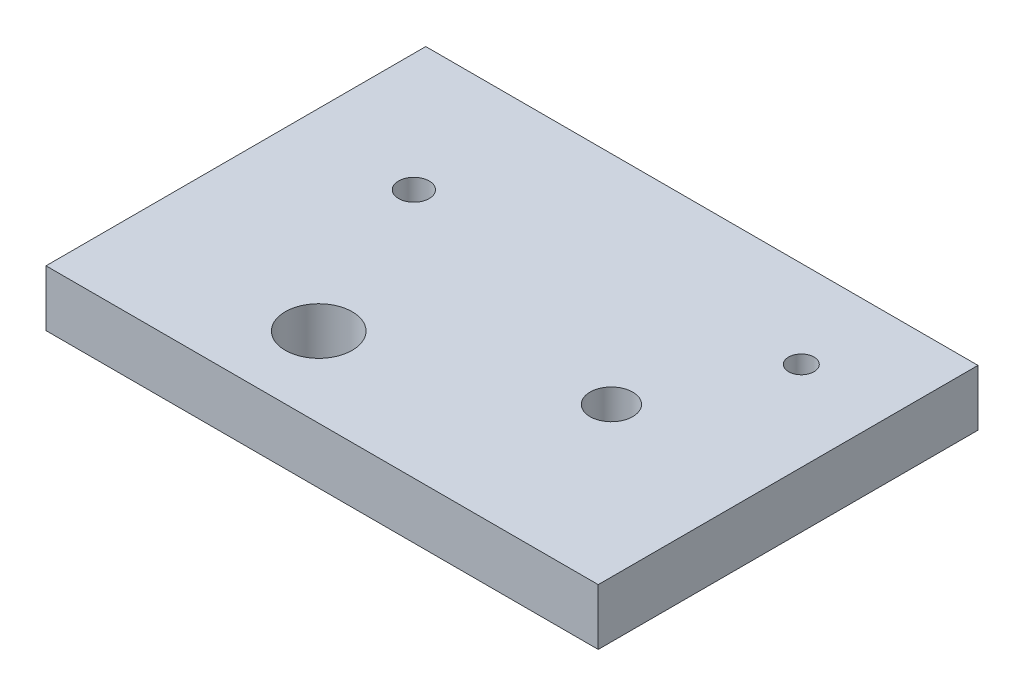
ISO-10303-21;
HEADER;
FILE_DESCRIPTION(('STEP AP214'),'2;1');
FILE_NAME('part.step','',(''),(''),'','','');
FILE_SCHEMA(('AUTOMOTIVE_DESIGN { 1 0 10303 214 1 1 1 1 }'));
ENDSEC;
DATA;
#1=APPLICATION_CONTEXT('core data for automotive mechanical design processes');
#2=APPLICATION_PROTOCOL_DEFINITION('international standard','automotive_design',2000,#1);
#3=PRODUCT_CONTEXT('',#1,'mechanical');
#4=PRODUCT('Part','Part','',(#3));
#5=PRODUCT_RELATED_PRODUCT_CATEGORY('part','',(#4));
#6=PRODUCT_DEFINITION_FORMATION('','',#4);
#7=PRODUCT_DEFINITION_CONTEXT('part definition',#1,'design');
#8=PRODUCT_DEFINITION('design','',#6,#7);
#9=PRODUCT_DEFINITION_SHAPE('','',#8);
#10=(LENGTH_UNIT() NAMED_UNIT(*) SI_UNIT(.MILLI.,.METRE.));
#11=(NAMED_UNIT(*) PLANE_ANGLE_UNIT() SI_UNIT($,.RADIAN.));
#12=(NAMED_UNIT(*) SI_UNIT($,.STERADIAN.) SOLID_ANGLE_UNIT());
#13=UNCERTAINTY_MEASURE_WITH_UNIT(LENGTH_MEASURE(1.E-05),#10,'distance_accuracy_value','');
#14=(GEOMETRIC_REPRESENTATION_CONTEXT(3) GLOBAL_UNCERTAINTY_ASSIGNED_CONTEXT((#13)) GLOBAL_UNIT_ASSIGNED_CONTEXT((#10,
#11,#12)) REPRESENTATION_CONTEXT('',''));
#15=CARTESIAN_POINT('',(0.,0.,0.));
#16=DIRECTION('',(0.,0.,1.));
#17=DIRECTION('',(1.,0.,0.));
#18=AXIS2_PLACEMENT_3D('',#15,#16,#17);
#19=CARTESIAN_POINT('',(0.,10.,0.));
#20=DIRECTION('',(0.,-1.,0.));
#21=DIRECTION('',(0.,0.,-1.));
#22=AXIS2_PLACEMENT_3D('',#19,#20,#21);
#23=PLANE('',#22);
#24=DIRECTION('',(0.,0.,1.));
#25=VECTOR('',#24,1.);
#26=CARTESIAN_POINT('',(-42.7766818500351,10.,28.9732655921514));
#27=LINE('',#26,#25);
#28=CARTESIAN_POINT('',(-42.7766818500351,10.,-38.6562368605466));
#29=VERTEX_POINT('',#28);
#30=CARTESIAN_POINT('',(-42.7766818500351,10.,28.9732655921514));
#31=VERTEX_POINT('',#30);
#32=EDGE_CURVE('E89',#29,#31,#27,.T.);
#33=ORIENTED_EDGE('',*,*,#32,.T.);
#34=DIRECTION('',(1.,0.,0.));
#35=VECTOR('',#34,1.);
#36=CARTESIAN_POINT('',(-42.7766818500351,10.,28.9732655921514));
#37=LINE('',#36,#35);
#38=CARTESIAN_POINT('',(55.5659950946041,10.,28.9732655921514));
#39=VERTEX_POINT('',#38);
#40=EDGE_CURVE('E84',#31,#39,#37,.T.);
#41=ORIENTED_EDGE('',*,*,#40,.T.);
#42=DIRECTION('',(0.,0.,-1.));
#43=VECTOR('',#42,1.);
#44=CARTESIAN_POINT('',(55.5659950946041,10.,28.9732655921514));
#45=LINE('',#44,#43);
#46=CARTESIAN_POINT('',(55.5659950946041,10.,-38.6562368605466));
#47=VERTEX_POINT('',#46);
#48=EDGE_CURVE('E87',#39,#47,#45,.T.);
#49=ORIENTED_EDGE('',*,*,#48,.T.);
#50=DIRECTION('',(-1.,0.,0.));
#51=VECTOR('',#50,1.);
#52=CARTESIAN_POINT('',(-42.7766818500351,10.,-38.6562368605466));
#53=LINE('',#52,#51);
#54=EDGE_CURVE('E54',#47,#29,#53,.T.);
#55=ORIENTED_EDGE('',*,*,#54,.T.);
#56=EDGE_LOOP('',(#33,#41,#49,#55));
#57=FACE_BOUND('',#56,.T.);
#58=CARTESIAN_POINT('',(39.6798703573931,10.,-23.072704975473));
#59=DIRECTION('',(0.,1.,0.));
#60=DIRECTION('',(0.,0.,1.));
#61=AXIS2_PLACEMENT_3D('',#58,#59,#60);
#62=CIRCLE('',#61,2.2694463910301);
#63=CARTESIAN_POINT('',(39.6798703573931,10.,-20.8032585844429));
#64=VERTEX_POINT('',#63);
#65=EDGE_CURVE('E104',#64,#64,#62,.T.);
#66=ORIENTED_EDGE('',*,*,#65,.F.);
#67=EDGE_LOOP('',(#66));
#68=FACE_BOUND('',#67,.T.);
#69=CARTESIAN_POINT('',(28.9378241065172,10.,0.));
#70=DIRECTION('',(0.,1.,0.));
#71=DIRECTION('',(0.,0.,1.));
#72=AXIS2_PLACEMENT_3D('',#69,#70,#71);
#73=CIRCLE('',#72,3.79826355497642);
#74=CARTESIAN_POINT('',(28.9378241065172,10.,3.79826355497642));
#75=VERTEX_POINT('',#74);
#76=EDGE_CURVE('E119',#75,#75,#73,.T.);
#77=ORIENTED_EDGE('',*,*,#76,.F.);
#78=EDGE_LOOP('',(#77));
#79=FACE_BOUND('',#78,.T.);
#80=CARTESIAN_POINT('',(-8.4323931324457,10.,14.7514015416959));
#81=DIRECTION('',(0.,1.,0.));
#82=DIRECTION('',(0.,0.,1.));
#83=AXIS2_PLACEMENT_3D('',#80,#81,#82);
#84=CIRCLE('',#83,5.96230786394098);
#85=CARTESIAN_POINT('',(-8.4323931324457,10.,20.7137094056368));
#86=VERTEX_POINT('',#85);
#87=EDGE_CURVE('E125',#86,#86,#84,.T.);
#88=ORIENTED_EDGE('',*,*,#87,.F.);
#89=EDGE_LOOP('',(#88));
#90=FACE_BOUND('',#89,.T.);
#91=CARTESIAN_POINT('',(-21.7464786264892,10.,-15.5078836720392));
#92=DIRECTION('',(0.,1.,0.));
#93=DIRECTION('',(0.,0.,1.));
#94=AXIS2_PLACEMENT_3D('',#91,#92,#93);
#95=CIRCLE('',#94,2.72333566923616);
#96=CARTESIAN_POINT('',(-21.7464786264892,10.,-12.7845480028031));
#97=VERTEX_POINT('',#96);
#98=EDGE_CURVE('E131',#97,#97,#95,.T.);
#99=ORIENTED_EDGE('',*,*,#98,.F.);
#100=EDGE_LOOP('',(#99));
#101=FACE_BOUND('',#100,.T.);
#102=ADVANCED_FACE('F37',(#57,#68,#79,#90,#101),#23,.F.);
#103=CARTESIAN_POINT('',(0.,0.,0.));
#104=DIRECTION('',(0.,-1.,0.));
#105=DIRECTION('',(0.,0.,-1.));
#106=AXIS2_PLACEMENT_3D('',#103,#104,#105);
#107=PLANE('',#106);
#108=CARTESIAN_POINT('',(-8.4323931324457,0.,14.7514015416959));
#109=DIRECTION('',(0.,1.,0.));
#110=DIRECTION('',(0.,0.,1.));
#111=AXIS2_PLACEMENT_3D('',#108,#109,#110);
#112=CIRCLE('',#111,5.96230786394098);
#113=CARTESIAN_POINT('',(-8.4323931324457,0.,20.7137094056368));
#114=VERTEX_POINT('',#113);
#115=EDGE_CURVE('E128',#114,#114,#112,.T.);
#116=ORIENTED_EDGE('',*,*,#115,.T.);
#117=EDGE_LOOP('',(#116));
#118=FACE_BOUND('',#117,.T.);
#119=CARTESIAN_POINT('',(39.6798703573931,0.,-23.072704975473));
#120=DIRECTION('',(0.,1.,0.));
#121=DIRECTION('',(0.,0.,1.));
#122=AXIS2_PLACEMENT_3D('',#119,#120,#121);
#123=CIRCLE('',#122,2.2694463910301);
#124=CARTESIAN_POINT('',(39.6798703573931,0.,-20.8032585844429));
#125=VERTEX_POINT('',#124);
#126=EDGE_CURVE('E116',#125,#125,#123,.T.);
#127=ORIENTED_EDGE('',*,*,#126,.T.);
#128=EDGE_LOOP('',(#127));
#129=FACE_BOUND('',#128,.T.);
#130=DIRECTION('',(0.,0.,1.));
#131=VECTOR('',#130,1.);
#132=CARTESIAN_POINT('',(-42.7766818500351,0.,28.9732655921514));
#133=LINE('',#132,#131);
#134=CARTESIAN_POINT('',(-42.7766818500351,0.,-38.6562368605466));
#135=VERTEX_POINT('',#134);
#136=CARTESIAN_POINT('',(-42.7766818500351,0.,28.9732655921514));
#137=VERTEX_POINT('',#136);
#138=EDGE_CURVE('E101',#135,#137,#133,.T.);
#139=ORIENTED_EDGE('',*,*,#138,.F.);
#140=DIRECTION('',(-1.,0.,0.));
#141=VECTOR('',#140,1.);
#142=CARTESIAN_POINT('',(-42.7766818500351,0.,-38.6562368605466));
#143=LINE('',#142,#141);
#144=CARTESIAN_POINT('',(55.5659950946041,0.,-38.6562368605466));
#145=VERTEX_POINT('',#144);
#146=EDGE_CURVE('E77',#145,#135,#143,.T.);
#147=ORIENTED_EDGE('',*,*,#146,.F.);
#148=DIRECTION('',(0.,0.,-1.));
#149=VECTOR('',#148,1.);
#150=CARTESIAN_POINT('',(55.5659950946041,0.,28.9732655921514));
#151=LINE('',#150,#149);
#152=CARTESIAN_POINT('',(55.5659950946041,0.,28.9732655921514));
#153=VERTEX_POINT('',#152);
#154=EDGE_CURVE('E71',#153,#145,#151,.T.);
#155=ORIENTED_EDGE('',*,*,#154,.F.);
#156=DIRECTION('',(1.,0.,0.));
#157=VECTOR('',#156,1.);
#158=CARTESIAN_POINT('',(-42.7766818500351,0.,28.9732655921514));
#159=LINE('',#158,#157);
#160=EDGE_CURVE('E93',#137,#153,#159,.T.);
#161=ORIENTED_EDGE('',*,*,#160,.F.);
#162=EDGE_LOOP('',(#139,#147,#155,#161));
#163=FACE_BOUND('',#162,.T.);
#164=CARTESIAN_POINT('',(28.9378241065172,0.,0.));
#165=DIRECTION('',(0.,1.,0.));
#166=DIRECTION('',(0.,0.,1.));
#167=AXIS2_PLACEMENT_3D('',#164,#165,#166);
#168=CIRCLE('',#167,3.79826355497642);
#169=CARTESIAN_POINT('',(28.9378241065172,0.,3.79826355497642));
#170=VERTEX_POINT('',#169);
#171=EDGE_CURVE('E122',#170,#170,#168,.T.);
#172=ORIENTED_EDGE('',*,*,#171,.T.);
#173=EDGE_LOOP('',(#172));
#174=FACE_BOUND('',#173,.T.);
#175=CARTESIAN_POINT('',(-21.7464786264892,0.,-15.5078836720392));
#176=DIRECTION('',(0.,1.,0.));
#177=DIRECTION('',(0.,0.,1.));
#178=AXIS2_PLACEMENT_3D('',#175,#176,#177);
#179=CIRCLE('',#178,2.72333566923616);
#180=CARTESIAN_POINT('',(-21.7464786264892,0.,-12.7845480028031));
#181=VERTEX_POINT('',#180);
#182=EDGE_CURVE('E134',#181,#181,#179,.T.);
#183=ORIENTED_EDGE('',*,*,#182,.T.);
#184=EDGE_LOOP('',(#183));
#185=FACE_BOUND('',#184,.T.);
#186=ADVANCED_FACE('F112',(#118,#129,#163,#174,#185),#107,.T.);
#187=CARTESIAN_POINT('',(-42.7766818500351,10.,28.9732655921514));
#188=DIRECTION('',(1.,0.,0.));
#189=DIRECTION('',(0.,0.,-1.));
#190=AXIS2_PLACEMENT_3D('',#187,#188,#189);
#191=PLANE('',#190);
#192=ORIENTED_EDGE('',*,*,#138,.T.);
#193=DIRECTION('',(0.,-1.,0.));
#194=VECTOR('',#193,1.);
#195=CARTESIAN_POINT('',(-42.7766818500351,10.,28.9732655921514));
#196=LINE('',#195,#194);
#197=EDGE_CURVE('E11',#31,#137,#196,.T.);
#198=ORIENTED_EDGE('',*,*,#197,.F.);
#199=ORIENTED_EDGE('',*,*,#32,.F.);
#200=DIRECTION('',(0.,-1.,0.));
#201=VECTOR('',#200,1.);
#202=CARTESIAN_POINT('',(-42.7766818500351,10.,-38.6562368605466));
#203=LINE('',#202,#201);
#204=EDGE_CURVE('E97',#29,#135,#203,.T.);
#205=ORIENTED_EDGE('',*,*,#204,.T.);
#206=EDGE_LOOP('',(#192,#198,#199,#205));
#207=FACE_BOUND('',#206,.T.);
#208=ADVANCED_FACE('F39',(#207),#191,.F.);
#209=CARTESIAN_POINT('',(-42.7766818500351,10.,28.9732655921514));
#210=DIRECTION('',(0.,0.,-1.));
#211=DIRECTION('',(-1.,0.,0.));
#212=AXIS2_PLACEMENT_3D('',#209,#210,#211);
#213=PLANE('',#212);
#214=ORIENTED_EDGE('',*,*,#160,.T.);
#215=DIRECTION('',(0.,-1.,0.));
#216=VECTOR('',#215,1.);
#217=CARTESIAN_POINT('',(55.5659950946041,10.,28.9732655921514));
#218=LINE('',#217,#216);
#219=EDGE_CURVE('E46',#39,#153,#218,.T.);
#220=ORIENTED_EDGE('',*,*,#219,.F.);
#221=ORIENTED_EDGE('',*,*,#40,.F.);
#222=ORIENTED_EDGE('',*,*,#197,.T.);
#223=EDGE_LOOP('',(#214,#220,#221,#222));
#224=FACE_BOUND('',#223,.T.);
#225=ADVANCED_FACE('F92',(#224),#213,.F.);
#226=CARTESIAN_POINT('',(55.5659950946041,10.,28.9732655921514));
#227=DIRECTION('',(-1.,0.,0.));
#228=DIRECTION('',(0.,0.,1.));
#229=AXIS2_PLACEMENT_3D('',#226,#227,#228);
#230=PLANE('',#229);
#231=ORIENTED_EDGE('',*,*,#154,.T.);
#232=DIRECTION('',(0.,-1.,0.));
#233=VECTOR('',#232,1.);
#234=CARTESIAN_POINT('',(55.5659950946041,10.,-38.6562368605466));
#235=LINE('',#234,#233);
#236=EDGE_CURVE('E94',#47,#145,#235,.T.);
#237=ORIENTED_EDGE('',*,*,#236,.F.);
#238=ORIENTED_EDGE('',*,*,#48,.F.);
#239=ORIENTED_EDGE('',*,*,#219,.T.);
#240=EDGE_LOOP('',(#231,#237,#238,#239));
#241=FACE_BOUND('',#240,.T.);
#242=ADVANCED_FACE('F95',(#241),#230,.F.);
#243=CARTESIAN_POINT('',(-42.7766818500351,10.,-38.6562368605466));
#244=DIRECTION('',(0.,0.,1.));
#245=DIRECTION('',(1.,0.,0.));
#246=AXIS2_PLACEMENT_3D('',#243,#244,#245);
#247=PLANE('',#246);
#248=ORIENTED_EDGE('',*,*,#146,.T.);
#249=ORIENTED_EDGE('',*,*,#204,.F.);
#250=ORIENTED_EDGE('',*,*,#54,.F.);
#251=ORIENTED_EDGE('',*,*,#236,.T.);
#252=EDGE_LOOP('',(#248,#249,#250,#251));
#253=FACE_BOUND('',#252,.T.);
#254=ADVANCED_FACE('F109',(#253),#247,.F.);
#255=CARTESIAN_POINT('',(39.6798703573931,10.,-23.072704975473));
#256=DIRECTION('',(0.,-1.,0.));
#257=DIRECTION('',(0.,0.,-1.));
#258=AXIS2_PLACEMENT_3D('',#255,#256,#257);
#259=CYLINDRICAL_SURFACE('',#258,2.2694463910301);
#260=ORIENTED_EDGE('',*,*,#65,.T.);
#261=EDGE_LOOP('',(#260));
#262=FACE_BOUND('',#261,.T.);
#263=ORIENTED_EDGE('',*,*,#126,.F.);
#264=EDGE_LOOP('',(#263));
#265=FACE_BOUND('',#264,.T.);
#266=ADVANCED_FACE('F151',(#262,#265),#259,.F.);
#267=CARTESIAN_POINT('',(28.9378241065172,10.,0.));
#268=DIRECTION('',(0.,-1.,0.));
#269=DIRECTION('',(0.,0.,-1.));
#270=AXIS2_PLACEMENT_3D('',#267,#268,#269);
#271=CYLINDRICAL_SURFACE('',#270,3.79826355497642);
#272=ORIENTED_EDGE('',*,*,#76,.T.);
#273=EDGE_LOOP('',(#272));
#274=FACE_BOUND('',#273,.T.);
#275=ORIENTED_EDGE('',*,*,#171,.F.);
#276=EDGE_LOOP('',(#275));
#277=FACE_BOUND('',#276,.T.);
#278=ADVANCED_FACE('F205',(#274,#277),#271,.F.);
#279=CARTESIAN_POINT('',(-8.4323931324457,10.,14.7514015416959));
#280=DIRECTION('',(0.,-1.,0.));
#281=DIRECTION('',(0.,0.,-1.));
#282=AXIS2_PLACEMENT_3D('',#279,#280,#281);
#283=CYLINDRICAL_SURFACE('',#282,5.96230786394098);
#284=ORIENTED_EDGE('',*,*,#87,.T.);
#285=EDGE_LOOP('',(#284));
#286=FACE_BOUND('',#285,.T.);
#287=ORIENTED_EDGE('',*,*,#115,.F.);
#288=EDGE_LOOP('',(#287));
#289=FACE_BOUND('',#288,.T.);
#290=ADVANCED_FACE('F214',(#286,#289),#283,.F.);
#291=CARTESIAN_POINT('',(-21.7464786264892,10.,-15.5078836720392));
#292=DIRECTION('',(0.,-1.,0.));
#293=DIRECTION('',(0.,0.,-1.));
#294=AXIS2_PLACEMENT_3D('',#291,#292,#293);
#295=CYLINDRICAL_SURFACE('',#294,2.72333566923616);
#296=ORIENTED_EDGE('',*,*,#98,.T.);
#297=EDGE_LOOP('',(#296));
#298=FACE_BOUND('',#297,.T.);
#299=ORIENTED_EDGE('',*,*,#182,.F.);
#300=EDGE_LOOP('',(#299));
#301=FACE_BOUND('',#300,.T.);
#302=ADVANCED_FACE('F140',(#298,#301),#295,.F.);
#303=CLOSED_SHELL('',(#102,#186,#208,#225,#242,#254,#266,#278,#290,#302));
#304=MANIFOLD_SOLID_BREP('B2',#303);
#305=ADVANCED_BREP_SHAPE_REPRESENTATION('',(#18,#304),#14);
#306=SHAPE_DEFINITION_REPRESENTATION(#9,#305);
ENDSEC;
END-ISO-10303-21;
